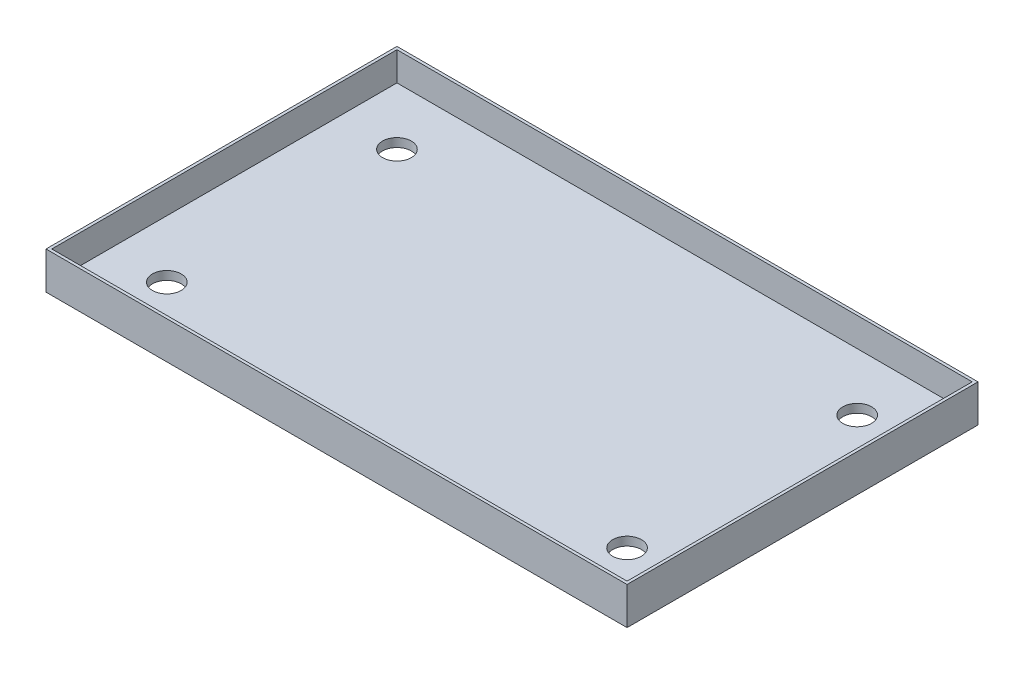
ISO-10303-21;
HEADER;
FILE_DESCRIPTION(('STEP AP214'),'2;1');
FILE_NAME('part.step','',(''),(''),'','','');
FILE_SCHEMA(('AUTOMOTIVE_DESIGN { 1 0 10303 214 1 1 1 1 }'));
ENDSEC;
DATA;
#1=APPLICATION_CONTEXT('core data for automotive mechanical design processes');
#2=APPLICATION_PROTOCOL_DEFINITION('international standard','automotive_design',2000,#1);
#3=PRODUCT_CONTEXT('',#1,'mechanical');
#4=PRODUCT('Part','Part','',(#3));
#5=PRODUCT_RELATED_PRODUCT_CATEGORY('part','',(#4));
#6=PRODUCT_DEFINITION_FORMATION('','',#4);
#7=PRODUCT_DEFINITION_CONTEXT('part definition',#1,'design');
#8=PRODUCT_DEFINITION('design','',#6,#7);
#9=PRODUCT_DEFINITION_SHAPE('','',#8);
#10=(LENGTH_UNIT() NAMED_UNIT(*) SI_UNIT(.MILLI.,.METRE.));
#11=(NAMED_UNIT(*) PLANE_ANGLE_UNIT() SI_UNIT($,.RADIAN.));
#12=(NAMED_UNIT(*) SI_UNIT($,.STERADIAN.) SOLID_ANGLE_UNIT());
#13=UNCERTAINTY_MEASURE_WITH_UNIT(LENGTH_MEASURE(1.E-05),#10,'distance_accuracy_value','');
#14=(GEOMETRIC_REPRESENTATION_CONTEXT(3) GLOBAL_UNCERTAINTY_ASSIGNED_CONTEXT((#13)) GLOBAL_UNIT_ASSIGNED_CONTEXT((#10,
#11,#12)) REPRESENTATION_CONTEXT('',''));
#15=CARTESIAN_POINT('',(0.,0.,0.));
#16=DIRECTION('',(0.,0.,1.));
#17=DIRECTION('',(1.,0.,0.));
#18=AXIS2_PLACEMENT_3D('',#15,#16,#17);
#19=CARTESIAN_POINT('',(0.,1.5,0.));
#20=DIRECTION('',(0.,1.,0.));
#21=DIRECTION('',(0.,0.,1.));
#22=AXIS2_PLACEMENT_3D('',#19,#20,#21);
#23=PLANE('',#22);
#24=CARTESIAN_POINT('',(80.,1.5,40.));
#25=DIRECTION('',(0.,1.,0.));
#26=DIRECTION('',(0.,0.,1.));
#27=AXIS2_PLACEMENT_3D('',#24,#25,#26);
#28=CIRCLE('',#27,5.00000000000001);
#29=CARTESIAN_POINT('',(80.,1.5,45.));
#30=VERTEX_POINT('',#29);
#31=EDGE_CURVE('E170',#30,#30,#28,.T.);
#32=ORIENTED_EDGE('',*,*,#31,.F.);
#33=EDGE_LOOP('',(#32));
#34=FACE_BOUND('',#33,.T.);
#35=CARTESIAN_POINT('',(-80.,1.5,-40.));
#36=DIRECTION('',(0.,1.,0.));
#37=DIRECTION('',(0.,0.,1.));
#38=AXIS2_PLACEMENT_3D('',#35,#36,#37);
#39=CIRCLE('',#38,5.00000000000001);
#40=CARTESIAN_POINT('',(-80.,1.5,-35.));
#41=VERTEX_POINT('',#40);
#42=EDGE_CURVE('E182',#41,#41,#39,.T.);
#43=ORIENTED_EDGE('',*,*,#42,.F.);
#44=EDGE_LOOP('',(#43));
#45=FACE_BOUND('',#44,.T.);
#46=DIRECTION('',(0.,0.,1.));
#47=VECTOR('',#46,1.);
#48=CARTESIAN_POINT('',(-100.,1.5,60.));
#49=LINE('',#48,#47);
#50=CARTESIAN_POINT('',(-100.,1.5,-60.));
#51=VERTEX_POINT('',#50);
#52=CARTESIAN_POINT('',(-100.,1.5,60.));
#53=VERTEX_POINT('',#52);
#54=EDGE_CURVE('E185',#51,#53,#49,.T.);
#55=ORIENTED_EDGE('',*,*,#54,.T.);
#56=DIRECTION('',(1.,0.,0.));
#57=VECTOR('',#56,1.);
#58=CARTESIAN_POINT('',(100.,1.5,60.));
#59=LINE('',#58,#57);
#60=CARTESIAN_POINT('',(100.,1.5,60.));
#61=VERTEX_POINT('',#60);
#62=EDGE_CURVE('E189',#53,#61,#59,.T.);
#63=ORIENTED_EDGE('',*,*,#62,.T.);
#64=DIRECTION('',(0.,0.,-1.));
#65=VECTOR('',#64,1.);
#66=CARTESIAN_POINT('',(100.,1.5,60.));
#67=LINE('',#66,#65);
#68=CARTESIAN_POINT('',(100.,1.5,-60.));
#69=VERTEX_POINT('',#68);
#70=EDGE_CURVE('E46',#61,#69,#67,.T.);
#71=ORIENTED_EDGE('',*,*,#70,.T.);
#72=DIRECTION('',(-1.,0.,0.));
#73=VECTOR('',#72,1.);
#74=CARTESIAN_POINT('',(100.,1.5,-60.));
#75=LINE('',#74,#73);
#76=EDGE_CURVE('E11',#69,#51,#75,.T.);
#77=ORIENTED_EDGE('',*,*,#76,.T.);
#78=EDGE_LOOP('',(#55,#63,#71,#77));
#79=FACE_BOUND('',#78,.T.);
#80=CARTESIAN_POINT('',(80.,1.5,-40.));
#81=DIRECTION('',(0.,1.,0.));
#82=DIRECTION('',(0.,0.,-1.));
#83=AXIS2_PLACEMENT_3D('',#80,#81,#82);
#84=CIRCLE('',#83,5.00000000000001);
#85=CARTESIAN_POINT('',(80.,1.5,-45.));
#86=VERTEX_POINT('',#85);
#87=EDGE_CURVE('E176',#86,#86,#84,.T.);
#88=ORIENTED_EDGE('',*,*,#87,.F.);
#89=EDGE_LOOP('',(#88));
#90=FACE_BOUND('',#89,.T.);
#91=CARTESIAN_POINT('',(-80.,1.5,40.));
#92=DIRECTION('',(0.,1.,0.));
#93=DIRECTION('',(0.,0.,-1.));
#94=AXIS2_PLACEMENT_3D('',#91,#92,#93);
#95=CIRCLE('',#94,5.00000000000001);
#96=CARTESIAN_POINT('',(-80.,1.5,35.));
#97=VERTEX_POINT('',#96);
#98=EDGE_CURVE('E164',#97,#97,#95,.T.);
#99=ORIENTED_EDGE('',*,*,#98,.F.);
#100=EDGE_LOOP('',(#99));
#101=FACE_BOUND('',#100,.T.);
#102=ADVANCED_FACE('F38',(#34,#45,#79,#90,#101),#23,.T.);
#103=CARTESIAN_POINT('',(0.,-1.5,0.));
#104=DIRECTION('',(0.,1.,0.));
#105=DIRECTION('',(0.,0.,1.));
#106=AXIS2_PLACEMENT_3D('',#103,#104,#105);
#107=PLANE('',#106);
#108=DIRECTION('',(0.,0.,1.));
#109=VECTOR('',#108,1.);
#110=CARTESIAN_POINT('',(101.,-1.5,-60.));
#111=LINE('',#110,#109);
#112=CARTESIAN_POINT('',(101.,-1.5,-61.));
#113=VERTEX_POINT('',#112);
#114=CARTESIAN_POINT('',(101.,-1.5,61.));
#115=VERTEX_POINT('',#114);
#116=EDGE_CURVE('E113',#113,#115,#111,.T.);
#117=ORIENTED_EDGE('',*,*,#116,.T.);
#118=DIRECTION('',(-1.,0.,0.));
#119=VECTOR('',#118,1.);
#120=CARTESIAN_POINT('',(101.,-1.5,61.));
#121=LINE('',#120,#119);
#122=CARTESIAN_POINT('',(-101.,-1.5,61.));
#123=VERTEX_POINT('',#122);
#124=EDGE_CURVE('E123',#115,#123,#121,.T.);
#125=ORIENTED_EDGE('',*,*,#124,.T.);
#126=DIRECTION('',(0.,0.,1.));
#127=VECTOR('',#126,1.);
#128=CARTESIAN_POINT('',(-101.,-1.5,-60.));
#129=LINE('',#128,#127);
#130=CARTESIAN_POINT('',(-101.,-1.5,-61.));
#131=VERTEX_POINT('',#130);
#132=EDGE_CURVE('E155',#131,#123,#129,.T.);
#133=ORIENTED_EDGE('',*,*,#132,.F.);
#134=DIRECTION('',(-1.,0.,0.));
#135=VECTOR('',#134,1.);
#136=CARTESIAN_POINT('',(101.,-1.5,-61.));
#137=LINE('',#136,#135);
#138=EDGE_CURVE('E137',#113,#131,#137,.T.);
#139=ORIENTED_EDGE('',*,*,#138,.F.);
#140=EDGE_LOOP('',(#117,#125,#133,#139));
#141=FACE_BOUND('',#140,.T.);
#142=CARTESIAN_POINT('',(-80.,-1.5,-40.));
#143=DIRECTION('',(0.,1.,0.));
#144=DIRECTION('',(0.,0.,1.));
#145=AXIS2_PLACEMENT_3D('',#142,#143,#144);
#146=CIRCLE('',#145,5.00000000000001);
#147=CARTESIAN_POINT('',(-80.,-1.5,-35.));
#148=VERTEX_POINT('',#147);
#149=EDGE_CURVE('E179',#148,#148,#146,.T.);
#150=ORIENTED_EDGE('',*,*,#149,.T.);
#151=EDGE_LOOP('',(#150));
#152=FACE_BOUND('',#151,.T.);
#153=CARTESIAN_POINT('',(80.,-1.5,-40.));
#154=DIRECTION('',(0.,1.,0.));
#155=DIRECTION('',(0.,0.,-1.));
#156=AXIS2_PLACEMENT_3D('',#153,#154,#155);
#157=CIRCLE('',#156,5.00000000000001);
#158=CARTESIAN_POINT('',(80.,-1.5,-45.));
#159=VERTEX_POINT('',#158);
#160=EDGE_CURVE('E173',#159,#159,#157,.T.);
#161=ORIENTED_EDGE('',*,*,#160,.T.);
#162=EDGE_LOOP('',(#161));
#163=FACE_BOUND('',#162,.T.);
#164=CARTESIAN_POINT('',(80.,-1.5,40.));
#165=DIRECTION('',(0.,1.,0.));
#166=DIRECTION('',(0.,0.,1.));
#167=AXIS2_PLACEMENT_3D('',#164,#165,#166);
#168=CIRCLE('',#167,5.00000000000001);
#169=CARTESIAN_POINT('',(80.,-1.5,45.));
#170=VERTEX_POINT('',#169);
#171=EDGE_CURVE('E167',#170,#170,#168,.T.);
#172=ORIENTED_EDGE('',*,*,#171,.T.);
#173=EDGE_LOOP('',(#172));
#174=FACE_BOUND('',#173,.T.);
#175=CARTESIAN_POINT('',(-80.,-1.5,40.));
#176=DIRECTION('',(0.,1.,0.));
#177=DIRECTION('',(0.,0.,-1.));
#178=AXIS2_PLACEMENT_3D('',#175,#176,#177);
#179=CIRCLE('',#178,5.00000000000001);
#180=CARTESIAN_POINT('',(-80.,-1.5,35.));
#181=VERTEX_POINT('',#180);
#182=EDGE_CURVE('E159',#181,#181,#179,.T.);
#183=ORIENTED_EDGE('',*,*,#182,.T.);
#184=EDGE_LOOP('',(#183));
#185=FACE_BOUND('',#184,.T.);
#186=ADVANCED_FACE('F40',(#141,#152,#163,#174,#185),#107,.F.);
#187=CARTESIAN_POINT('',(-80.,1.5,-40.));
#188=DIRECTION('',(0.,-1.,0.));
#189=DIRECTION('',(0.,0.,-1.));
#190=AXIS2_PLACEMENT_3D('',#187,#188,#189);
#191=CYLINDRICAL_SURFACE('',#190,5.00000000000001);
#192=ORIENTED_EDGE('',*,*,#42,.T.);
#193=EDGE_LOOP('',(#192));
#194=FACE_BOUND('',#193,.T.);
#195=ORIENTED_EDGE('',*,*,#149,.F.);
#196=EDGE_LOOP('',(#195));
#197=FACE_BOUND('',#196,.T.);
#198=ADVANCED_FACE('F221',(#194,#197),#191,.F.);
#199=CARTESIAN_POINT('',(80.,1.5,-40.));
#200=DIRECTION('',(0.,-1.,0.));
#201=DIRECTION('',(0.,0.,-1.));
#202=AXIS2_PLACEMENT_3D('',#199,#200,#201);
#203=CYLINDRICAL_SURFACE('',#202,5.00000000000001);
#204=ORIENTED_EDGE('',*,*,#87,.T.);
#205=EDGE_LOOP('',(#204));
#206=FACE_BOUND('',#205,.T.);
#207=ORIENTED_EDGE('',*,*,#160,.F.);
#208=EDGE_LOOP('',(#207));
#209=FACE_BOUND('',#208,.T.);
#210=ADVANCED_FACE('F228',(#206,#209),#203,.F.);
#211=CARTESIAN_POINT('',(80.,1.5,40.));
#212=DIRECTION('',(0.,-1.,0.));
#213=DIRECTION('',(0.,0.,-1.));
#214=AXIS2_PLACEMENT_3D('',#211,#212,#213);
#215=CYLINDRICAL_SURFACE('',#214,5.00000000000001);
#216=ORIENTED_EDGE('',*,*,#31,.T.);
#217=EDGE_LOOP('',(#216));
#218=FACE_BOUND('',#217,.T.);
#219=ORIENTED_EDGE('',*,*,#171,.F.);
#220=EDGE_LOOP('',(#219));
#221=FACE_BOUND('',#220,.T.);
#222=ADVANCED_FACE('F232',(#218,#221),#215,.F.);
#223=CARTESIAN_POINT('',(-80.,1.5,40.));
#224=DIRECTION('',(0.,-1.,0.));
#225=DIRECTION('',(0.,0.,-1.));
#226=AXIS2_PLACEMENT_3D('',#223,#224,#225);
#227=CYLINDRICAL_SURFACE('',#226,5.00000000000001);
#228=ORIENTED_EDGE('',*,*,#98,.T.);
#229=EDGE_LOOP('',(#228));
#230=FACE_BOUND('',#229,.T.);
#231=ORIENTED_EDGE('',*,*,#182,.F.);
#232=EDGE_LOOP('',(#231));
#233=FACE_BOUND('',#232,.T.);
#234=ADVANCED_FACE('F236',(#230,#233),#227,.F.);
#235=CARTESIAN_POINT('',(-100.,0.,0.));
#236=DIRECTION('',(1.,0.,0.));
#237=DIRECTION('',(0.,0.,-1.));
#238=AXIS2_PLACEMENT_3D('',#235,#236,#237);
#239=PLANE('',#238);
#240=ORIENTED_EDGE('',*,*,#54,.F.);
#241=DIRECTION('',(0.,-1.,0.));
#242=VECTOR('',#241,1.);
#243=CARTESIAN_POINT('',(-100.,-1.5,-60.));
#244=LINE('',#243,#242);
#245=CARTESIAN_POINT('',(-100.,11.5,-60.));
#246=VERTEX_POINT('',#245);
#247=EDGE_CURVE('E149',#246,#51,#244,.T.);
#248=ORIENTED_EDGE('',*,*,#247,.F.);
#249=DIRECTION('',(0.,0.,-1.));
#250=VECTOR('',#249,1.);
#251=CARTESIAN_POINT('',(-100.,11.5,-60.));
#252=LINE('',#251,#250);
#253=CARTESIAN_POINT('',(-100.,11.5,60.));
#254=VERTEX_POINT('',#253);
#255=EDGE_CURVE('E157',#254,#246,#252,.T.);
#256=ORIENTED_EDGE('',*,*,#255,.F.);
#257=DIRECTION('',(0.,1.,0.));
#258=VECTOR('',#257,1.);
#259=CARTESIAN_POINT('',(-100.,-1.5,60.));
#260=LINE('',#259,#258);
#261=EDGE_CURVE('E59',#53,#254,#260,.T.);
#262=ORIENTED_EDGE('',*,*,#261,.F.);
#263=EDGE_LOOP('',(#240,#248,#256,#262));
#264=FACE_BOUND('',#263,.T.);
#265=ADVANCED_FACE('F203',(#264),#239,.T.);
#266=CARTESIAN_POINT('',(-101.,11.5,-60.));
#267=DIRECTION('',(0.,-1.,0.));
#268=DIRECTION('',(0.,0.,-1.));
#269=AXIS2_PLACEMENT_3D('',#266,#267,#268);
#270=PLANE('',#269);
#271=DIRECTION('',(0.,0.,-1.));
#272=VECTOR('',#271,1.);
#273=CARTESIAN_POINT('',(100.,11.5,-60.));
#274=LINE('',#273,#272);
#275=CARTESIAN_POINT('',(100.,11.5,60.));
#276=VERTEX_POINT('',#275);
#277=CARTESIAN_POINT('',(100.,11.5,-60.));
#278=VERTEX_POINT('',#277);
#279=EDGE_CURVE('E151',#276,#278,#274,.T.);
#280=ORIENTED_EDGE('',*,*,#279,.F.);
#281=DIRECTION('',(1.,0.,0.));
#282=VECTOR('',#281,1.);
#283=CARTESIAN_POINT('',(101.,11.5,60.));
#284=LINE('',#283,#282);
#285=EDGE_CURVE('E124',#254,#276,#284,.T.);
#286=ORIENTED_EDGE('',*,*,#285,.F.);
#287=ORIENTED_EDGE('',*,*,#255,.T.);
#288=DIRECTION('',(1.,0.,0.));
#289=VECTOR('',#288,1.);
#290=CARTESIAN_POINT('',(101.,11.5,-60.));
#291=LINE('',#290,#289);
#292=EDGE_CURVE('E133',#246,#278,#291,.T.);
#293=ORIENTED_EDGE('',*,*,#292,.T.);
#294=EDGE_LOOP('',(#280,#286,#287,#293));
#295=FACE_BOUND('',#294,.T.);
#296=DIRECTION('',(1.,0.,0.));
#297=VECTOR('',#296,1.);
#298=CARTESIAN_POINT('',(101.,11.5,61.));
#299=LINE('',#298,#297);
#300=CARTESIAN_POINT('',(-101.,11.5,61.));
#301=VERTEX_POINT('',#300);
#302=CARTESIAN_POINT('',(101.,11.5,61.));
#303=VERTEX_POINT('',#302);
#304=EDGE_CURVE('E120',#301,#303,#299,.T.);
#305=ORIENTED_EDGE('',*,*,#304,.T.);
#306=DIRECTION('',(0.,0.,-1.));
#307=VECTOR('',#306,1.);
#308=CARTESIAN_POINT('',(101.,11.5,-60.));
#309=LINE('',#308,#307);
#310=CARTESIAN_POINT('',(101.,11.5,-61.));
#311=VERTEX_POINT('',#310);
#312=EDGE_CURVE('E102',#303,#311,#309,.T.);
#313=ORIENTED_EDGE('',*,*,#312,.T.);
#314=DIRECTION('',(1.,0.,0.));
#315=VECTOR('',#314,1.);
#316=CARTESIAN_POINT('',(101.,11.5,-61.));
#317=LINE('',#316,#315);
#318=CARTESIAN_POINT('',(-101.,11.5,-61.));
#319=VERTEX_POINT('',#318);
#320=EDGE_CURVE('E143',#319,#311,#317,.T.);
#321=ORIENTED_EDGE('',*,*,#320,.F.);
#322=DIRECTION('',(0.,0.,-1.));
#323=VECTOR('',#322,1.);
#324=CARTESIAN_POINT('',(-101.,11.5,-60.));
#325=LINE('',#324,#323);
#326=EDGE_CURVE('E127',#301,#319,#325,.T.);
#327=ORIENTED_EDGE('',*,*,#326,.F.);
#328=EDGE_LOOP('',(#305,#313,#321,#327));
#329=FACE_BOUND('',#328,.T.);
#330=ADVANCED_FACE('F126',(#295,#329),#270,.F.);
#331=CARTESIAN_POINT('',(-101.,0.,0.));
#332=DIRECTION('',(1.,0.,0.));
#333=DIRECTION('',(0.,0.,-1.));
#334=AXIS2_PLACEMENT_3D('',#331,#332,#333);
#335=PLANE('',#334);
#336=ORIENTED_EDGE('',*,*,#326,.T.);
#337=DIRECTION('',(0.,1.,0.));
#338=VECTOR('',#337,1.);
#339=CARTESIAN_POINT('',(-101.,-1.5,-61.));
#340=LINE('',#339,#338);
#341=EDGE_CURVE('E140',#131,#319,#340,.T.);
#342=ORIENTED_EDGE('',*,*,#341,.F.);
#343=ORIENTED_EDGE('',*,*,#132,.T.);
#344=DIRECTION('',(0.,1.,0.));
#345=VECTOR('',#344,1.);
#346=CARTESIAN_POINT('',(-101.,-1.5,61.));
#347=LINE('',#346,#345);
#348=EDGE_CURVE('E128',#123,#301,#347,.T.);
#349=ORIENTED_EDGE('',*,*,#348,.T.);
#350=EDGE_LOOP('',(#336,#342,#343,#349));
#351=FACE_BOUND('',#350,.T.);
#352=ADVANCED_FACE('F243',(#351),#335,.F.);
#353=CARTESIAN_POINT('',(100.,0.,0.));
#354=DIRECTION('',(-1.,0.,0.));
#355=DIRECTION('',(0.,0.,-1.));
#356=AXIS2_PLACEMENT_3D('',#353,#354,#355);
#357=PLANE('',#356);
#358=ORIENTED_EDGE('',*,*,#70,.F.);
#359=DIRECTION('',(0.,1.,0.));
#360=VECTOR('',#359,1.);
#361=CARTESIAN_POINT('',(100.,-1.5,60.));
#362=LINE('',#361,#360);
#363=EDGE_CURVE('E114',#61,#276,#362,.T.);
#364=ORIENTED_EDGE('',*,*,#363,.T.);
#365=ORIENTED_EDGE('',*,*,#279,.T.);
#366=DIRECTION('',(0.,-1.,0.));
#367=VECTOR('',#366,1.);
#368=CARTESIAN_POINT('',(100.,-1.5,-60.));
#369=LINE('',#368,#367);
#370=EDGE_CURVE('E145',#278,#69,#369,.T.);
#371=ORIENTED_EDGE('',*,*,#370,.T.);
#372=EDGE_LOOP('',(#358,#364,#365,#371));
#373=FACE_BOUND('',#372,.T.);
#374=ADVANCED_FACE('F197',(#373),#357,.T.);
#375=CARTESIAN_POINT('',(101.,0.,0.));
#376=DIRECTION('',(-1.,0.,0.));
#377=DIRECTION('',(0.,0.,-1.));
#378=AXIS2_PLACEMENT_3D('',#375,#376,#377);
#379=PLANE('',#378);
#380=ORIENTED_EDGE('',*,*,#116,.F.);
#381=DIRECTION('',(0.,-1.,0.));
#382=VECTOR('',#381,1.);
#383=CARTESIAN_POINT('',(101.,-1.5,-61.));
#384=LINE('',#383,#382);
#385=EDGE_CURVE('E108',#311,#113,#384,.T.);
#386=ORIENTED_EDGE('',*,*,#385,.F.);
#387=ORIENTED_EDGE('',*,*,#312,.F.);
#388=DIRECTION('',(0.,-1.,0.));
#389=VECTOR('',#388,1.);
#390=CARTESIAN_POINT('',(101.,-1.5,61.));
#391=LINE('',#390,#389);
#392=EDGE_CURVE('E105',#303,#115,#391,.T.);
#393=ORIENTED_EDGE('',*,*,#392,.T.);
#394=EDGE_LOOP('',(#380,#386,#387,#393));
#395=FACE_BOUND('',#394,.T.);
#396=ADVANCED_FACE('F104',(#395),#379,.F.);
#397=CARTESIAN_POINT('',(0.,0.,-61.));
#398=DIRECTION('',(0.,0.,1.));
#399=DIRECTION('',(1.,0.,0.));
#400=AXIS2_PLACEMENT_3D('',#397,#398,#399);
#401=PLANE('',#400);
#402=ORIENTED_EDGE('',*,*,#385,.T.);
#403=ORIENTED_EDGE('',*,*,#138,.T.);
#404=ORIENTED_EDGE('',*,*,#341,.T.);
#405=ORIENTED_EDGE('',*,*,#320,.T.);
#406=EDGE_LOOP('',(#402,#403,#404,#405));
#407=FACE_BOUND('',#406,.T.);
#408=ADVANCED_FACE('F213',(#407),#401,.F.);
#409=CARTESIAN_POINT('',(0.,0.,-60.));
#410=DIRECTION('',(0.,0.,1.));
#411=DIRECTION('',(1.,0.,0.));
#412=AXIS2_PLACEMENT_3D('',#409,#410,#411);
#413=PLANE('',#412);
#414=ORIENTED_EDGE('',*,*,#292,.F.);
#415=ORIENTED_EDGE('',*,*,#247,.T.);
#416=ORIENTED_EDGE('',*,*,#76,.F.);
#417=ORIENTED_EDGE('',*,*,#370,.F.);
#418=EDGE_LOOP('',(#414,#415,#416,#417));
#419=FACE_BOUND('',#418,.T.);
#420=ADVANCED_FACE('F199',(#419),#413,.T.);
#421=CARTESIAN_POINT('',(0.,0.,60.));
#422=DIRECTION('',(0.,0.,-1.));
#423=DIRECTION('',(1.,0.,0.));
#424=AXIS2_PLACEMENT_3D('',#421,#422,#423);
#425=PLANE('',#424);
#426=ORIENTED_EDGE('',*,*,#363,.F.);
#427=ORIENTED_EDGE('',*,*,#62,.F.);
#428=ORIENTED_EDGE('',*,*,#261,.T.);
#429=ORIENTED_EDGE('',*,*,#285,.T.);
#430=EDGE_LOOP('',(#426,#427,#428,#429));
#431=FACE_BOUND('',#430,.T.);
#432=ADVANCED_FACE('F205',(#431),#425,.T.);
#433=CARTESIAN_POINT('',(0.,0.,61.));
#434=DIRECTION('',(0.,0.,-1.));
#435=DIRECTION('',(1.,0.,0.));
#436=AXIS2_PLACEMENT_3D('',#433,#434,#435);
#437=PLANE('',#436);
#438=ORIENTED_EDGE('',*,*,#392,.F.);
#439=ORIENTED_EDGE('',*,*,#304,.F.);
#440=ORIENTED_EDGE('',*,*,#348,.F.);
#441=ORIENTED_EDGE('',*,*,#124,.F.);
#442=EDGE_LOOP('',(#438,#439,#440,#441));
#443=FACE_BOUND('',#442,.T.);
#444=ADVANCED_FACE('F118',(#443),#437,.F.);
#445=CLOSED_SHELL('',(#102,#186,#198,#210,#222,#234,#265,#330,#352,#374,#396,#408,#420,#432,#444));
#446=MANIFOLD_SOLID_BREP('B2',#445);
#447=ADVANCED_BREP_SHAPE_REPRESENTATION('',(#18,#446),#14);
#448=SHAPE_DEFINITION_REPRESENTATION(#9,#447);
ENDSEC;
END-ISO-10303-21;
